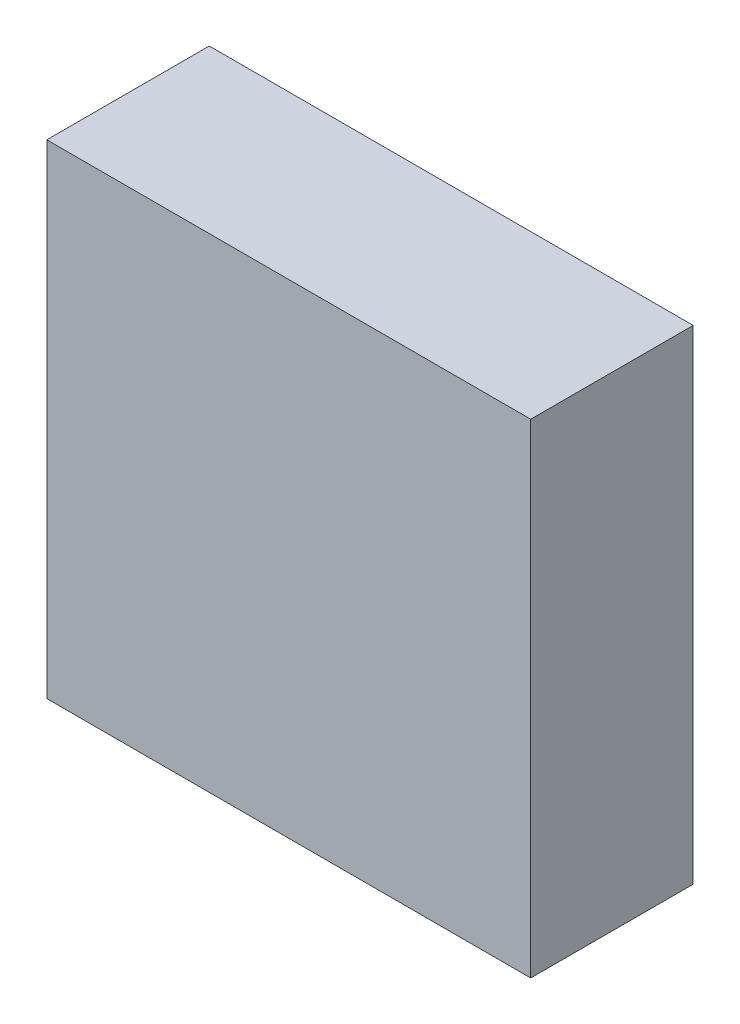
ISO-10303-21;
HEADER;
FILE_DESCRIPTION(('STEP AP214'),'2;1');
FILE_NAME('part.step','',(''),(''),'','','');
FILE_SCHEMA(('AUTOMOTIVE_DESIGN { 1 0 10303 214 1 1 1 1 }'));
ENDSEC;
DATA;
#1=APPLICATION_CONTEXT('core data for automotive mechanical design processes');
#2=APPLICATION_PROTOCOL_DEFINITION('international standard','automotive_design',2000,#1);
#3=PRODUCT_CONTEXT('',#1,'mechanical');
#4=PRODUCT('Part','Part','',(#3));
#5=PRODUCT_RELATED_PRODUCT_CATEGORY('part','',(#4));
#6=PRODUCT_DEFINITION_FORMATION('','',#4);
#7=PRODUCT_DEFINITION_CONTEXT('part definition',#1,'design');
#8=PRODUCT_DEFINITION('design','',#6,#7);
#9=PRODUCT_DEFINITION_SHAPE('','',#8);
#10=(LENGTH_UNIT() NAMED_UNIT(*) SI_UNIT(.MILLI.,.METRE.));
#11=(NAMED_UNIT(*) PLANE_ANGLE_UNIT() SI_UNIT($,.RADIAN.));
#12=(NAMED_UNIT(*) SI_UNIT($,.STERADIAN.) SOLID_ANGLE_UNIT());
#13=UNCERTAINTY_MEASURE_WITH_UNIT(LENGTH_MEASURE(1.E-05),#10,'distance_accuracy_value','');
#14=(GEOMETRIC_REPRESENTATION_CONTEXT(3) GLOBAL_UNCERTAINTY_ASSIGNED_CONTEXT((#13)) GLOBAL_UNIT_ASSIGNED_CONTEXT((#10,
#11,#12)) REPRESENTATION_CONTEXT('',''));
#15=CARTESIAN_POINT('',(0.,0.,0.));
#16=DIRECTION('',(0.,0.,1.));
#17=DIRECTION('',(1.,0.,0.));
#18=AXIS2_PLACEMENT_3D('',#15,#16,#17);
#19=CARTESIAN_POINT('',(4.17,-4.17,2.8));
#20=DIRECTION('',(-1.,0.,0.));
#21=DIRECTION('',(0.,0.,1.));
#22=AXIS2_PLACEMENT_3D('',#19,#20,#21);
#23=PLANE('',#22);
#24=DIRECTION('',(0.,1.,0.));
#25=VECTOR('',#24,1.);
#26=CARTESIAN_POINT('',(4.17,-4.17,0.));
#27=LINE('',#26,#25);
#28=CARTESIAN_POINT('',(4.17,-4.17,0.));
#29=VERTEX_POINT('',#28);
#30=CARTESIAN_POINT('',(4.17,4.17,0.));
#31=VERTEX_POINT('',#30);
#32=EDGE_CURVE('E102',#29,#31,#27,.T.);
#33=ORIENTED_EDGE('',*,*,#32,.T.);
#34=DIRECTION('',(0.,0.,-1.));
#35=VECTOR('',#34,1.);
#36=CARTESIAN_POINT('',(4.17,4.17,2.8));
#37=LINE('',#36,#35);
#38=CARTESIAN_POINT('',(4.17,4.17,2.8));
#39=VERTEX_POINT('',#38);
#40=EDGE_CURVE('E11',#39,#31,#37,.T.);
#41=ORIENTED_EDGE('',*,*,#40,.F.);
#42=DIRECTION('',(0.,1.,0.));
#43=VECTOR('',#42,1.);
#44=CARTESIAN_POINT('',(4.17,-4.17,2.8));
#45=LINE('',#44,#43);
#46=CARTESIAN_POINT('',(4.17,-4.17,2.8));
#47=VERTEX_POINT('',#46);
#48=EDGE_CURVE('E90',#47,#39,#45,.T.);
#49=ORIENTED_EDGE('',*,*,#48,.F.);
#50=DIRECTION('',(0.,0.,-1.));
#51=VECTOR('',#50,1.);
#52=CARTESIAN_POINT('',(4.17,-4.17,2.8));
#53=LINE('',#52,#51);
#54=EDGE_CURVE('E98',#47,#29,#53,.T.);
#55=ORIENTED_EDGE('',*,*,#54,.T.);
#56=EDGE_LOOP('',(#33,#41,#49,#55));
#57=FACE_BOUND('',#56,.T.);
#58=ADVANCED_FACE('F39',(#57),#23,.F.);
#59=CARTESIAN_POINT('',(-4.17,4.17,2.8));
#60=DIRECTION('',(0.,-1.,0.));
#61=DIRECTION('',(0.,0.,-1.));
#62=AXIS2_PLACEMENT_3D('',#59,#60,#61);
#63=PLANE('',#62);
#64=DIRECTION('',(-1.,0.,0.));
#65=VECTOR('',#64,1.);
#66=CARTESIAN_POINT('',(-4.17,4.17,0.));
#67=LINE('',#66,#65);
#68=CARTESIAN_POINT('',(-4.17,4.17,0.));
#69=VERTEX_POINT('',#68);
#70=EDGE_CURVE('E94',#31,#69,#67,.T.);
#71=ORIENTED_EDGE('',*,*,#70,.T.);
#72=DIRECTION('',(0.,0.,-1.));
#73=VECTOR('',#72,1.);
#74=CARTESIAN_POINT('',(-4.17,4.17,2.8));
#75=LINE('',#74,#73);
#76=CARTESIAN_POINT('',(-4.17,4.17,2.8));
#77=VERTEX_POINT('',#76);
#78=EDGE_CURVE('E47',#77,#69,#75,.T.);
#79=ORIENTED_EDGE('',*,*,#78,.F.);
#80=DIRECTION('',(-1.,0.,0.));
#81=VECTOR('',#80,1.);
#82=CARTESIAN_POINT('',(-4.17,4.17,2.8));
#83=LINE('',#82,#81);
#84=EDGE_CURVE('E85',#39,#77,#83,.T.);
#85=ORIENTED_EDGE('',*,*,#84,.F.);
#86=ORIENTED_EDGE('',*,*,#40,.T.);
#87=EDGE_LOOP('',(#71,#79,#85,#86));
#88=FACE_BOUND('',#87,.T.);
#89=ADVANCED_FACE('F93',(#88),#63,.F.);
#90=CARTESIAN_POINT('',(-4.17,-4.17,2.8));
#91=DIRECTION('',(1.,0.,0.));
#92=DIRECTION('',(0.,0.,-1.));
#93=AXIS2_PLACEMENT_3D('',#90,#91,#92);
#94=PLANE('',#93);
#95=DIRECTION('',(0.,-1.,0.));
#96=VECTOR('',#95,1.);
#97=CARTESIAN_POINT('',(-4.17,-4.17,0.));
#98=LINE('',#97,#96);
#99=CARTESIAN_POINT('',(-4.17,-4.17,0.));
#100=VERTEX_POINT('',#99);
#101=EDGE_CURVE('E72',#69,#100,#98,.T.);
#102=ORIENTED_EDGE('',*,*,#101,.T.);
#103=DIRECTION('',(0.,0.,-1.));
#104=VECTOR('',#103,1.);
#105=CARTESIAN_POINT('',(-4.17,-4.17,2.8));
#106=LINE('',#105,#104);
#107=CARTESIAN_POINT('',(-4.17,-4.17,2.8));
#108=VERTEX_POINT('',#107);
#109=EDGE_CURVE('E95',#108,#100,#106,.T.);
#110=ORIENTED_EDGE('',*,*,#109,.F.);
#111=DIRECTION('',(0.,-1.,0.));
#112=VECTOR('',#111,1.);
#113=CARTESIAN_POINT('',(-4.17,-4.17,2.8));
#114=LINE('',#113,#112);
#115=EDGE_CURVE('E88',#77,#108,#114,.T.);
#116=ORIENTED_EDGE('',*,*,#115,.F.);
#117=ORIENTED_EDGE('',*,*,#78,.T.);
#118=EDGE_LOOP('',(#102,#110,#116,#117));
#119=FACE_BOUND('',#118,.T.);
#120=ADVANCED_FACE('F96',(#119),#94,.F.);
#121=CARTESIAN_POINT('',(-4.17,-4.17,2.8));
#122=DIRECTION('',(0.,1.,0.));
#123=DIRECTION('',(0.,0.,1.));
#124=AXIS2_PLACEMENT_3D('',#121,#122,#123);
#125=PLANE('',#124);
#126=DIRECTION('',(1.,0.,0.));
#127=VECTOR('',#126,1.);
#128=CARTESIAN_POINT('',(-4.17,-4.17,0.));
#129=LINE('',#128,#127);
#130=EDGE_CURVE('E78',#100,#29,#129,.T.);
#131=ORIENTED_EDGE('',*,*,#130,.T.);
#132=ORIENTED_EDGE('',*,*,#54,.F.);
#133=DIRECTION('',(1.,0.,0.));
#134=VECTOR('',#133,1.);
#135=CARTESIAN_POINT('',(-4.17,-4.17,2.8));
#136=LINE('',#135,#134);
#137=EDGE_CURVE('E55',#108,#47,#136,.T.);
#138=ORIENTED_EDGE('',*,*,#137,.F.);
#139=ORIENTED_EDGE('',*,*,#109,.T.);
#140=EDGE_LOOP('',(#131,#132,#138,#139));
#141=FACE_BOUND('',#140,.T.);
#142=ADVANCED_FACE('F109',(#141),#125,.F.);
#143=CARTESIAN_POINT('',(0.,0.,2.8));
#144=DIRECTION('',(0.,0.,-1.));
#145=DIRECTION('',(-1.,0.,0.));
#146=AXIS2_PLACEMENT_3D('',#143,#144,#145);
#147=PLANE('',#146);
#148=ORIENTED_EDGE('',*,*,#48,.T.);
#149=ORIENTED_EDGE('',*,*,#84,.T.);
#150=ORIENTED_EDGE('',*,*,#115,.T.);
#151=ORIENTED_EDGE('',*,*,#137,.T.);
#152=EDGE_LOOP('',(#148,#149,#150,#151));
#153=FACE_BOUND('',#152,.T.);
#154=ADVANCED_FACE('F86',(#153),#147,.F.);
#155=CARTESIAN_POINT('',(0.,0.,0.));
#156=DIRECTION('',(0.,0.,-1.));
#157=DIRECTION('',(-1.,0.,0.));
#158=AXIS2_PLACEMENT_3D('',#155,#156,#157);
#159=PLANE('',#158);
#160=ORIENTED_EDGE('',*,*,#32,.F.);
#161=ORIENTED_EDGE('',*,*,#130,.F.);
#162=ORIENTED_EDGE('',*,*,#101,.F.);
#163=ORIENTED_EDGE('',*,*,#70,.F.);
#164=EDGE_LOOP('',(#160,#161,#162,#163));
#165=FACE_BOUND('',#164,.T.);
#166=ADVANCED_FACE('F112',(#165),#159,.T.);
#167=CLOSED_SHELL('',(#58,#89,#120,#142,#154,#166));
#168=MANIFOLD_SOLID_BREP('B2',#167);
#169=ADVANCED_BREP_SHAPE_REPRESENTATION('',(#18,#168),#14);
#170=SHAPE_DEFINITION_REPRESENTATION(#9,#169);
ENDSEC;
END-ISO-10303-21;
